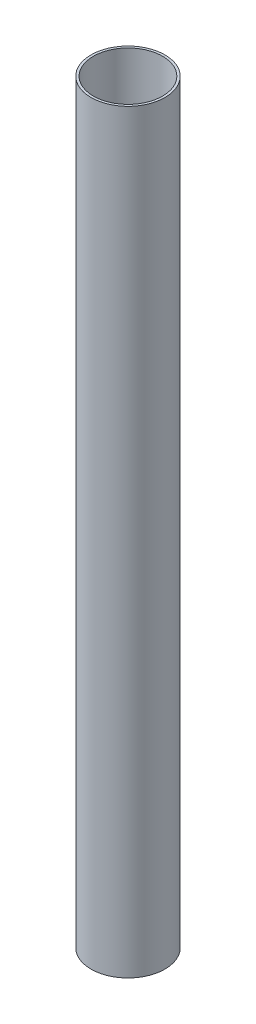
ISO-10303-21;
HEADER;
FILE_DESCRIPTION(('STEP AP214'),'2;1');
FILE_NAME('part.step','',(''),(''),'','','');
FILE_SCHEMA(('AUTOMOTIVE_DESIGN { 1 0 10303 214 1 1 1 1 }'));
ENDSEC;
DATA;
#1=APPLICATION_CONTEXT('core data for automotive mechanical design processes');
#2=APPLICATION_PROTOCOL_DEFINITION('international standard','automotive_design',2000,#1);
#3=PRODUCT_CONTEXT('',#1,'mechanical');
#4=PRODUCT('Part','Part','',(#3));
#5=PRODUCT_RELATED_PRODUCT_CATEGORY('part','',(#4));
#6=PRODUCT_DEFINITION_FORMATION('','',#4);
#7=PRODUCT_DEFINITION_CONTEXT('part definition',#1,'design');
#8=PRODUCT_DEFINITION('design','',#6,#7);
#9=PRODUCT_DEFINITION_SHAPE('','',#8);
#10=(LENGTH_UNIT() NAMED_UNIT(*) SI_UNIT(.MILLI.,.METRE.));
#11=(NAMED_UNIT(*) PLANE_ANGLE_UNIT() SI_UNIT($,.RADIAN.));
#12=(NAMED_UNIT(*) SI_UNIT($,.STERADIAN.) SOLID_ANGLE_UNIT());
#13=UNCERTAINTY_MEASURE_WITH_UNIT(LENGTH_MEASURE(1.E-05),#10,'distance_accuracy_value','');
#14=(GEOMETRIC_REPRESENTATION_CONTEXT(3) GLOBAL_UNCERTAINTY_ASSIGNED_CONTEXT((#13)) GLOBAL_UNIT_ASSIGNED_CONTEXT((#10,
#11,#12)) REPRESENTATION_CONTEXT('',''));
#15=CARTESIAN_POINT('',(0.,0.,0.));
#16=DIRECTION('',(0.,0.,1.));
#17=DIRECTION('',(1.,0.,0.));
#18=AXIS2_PLACEMENT_3D('',#15,#16,#17);
#19=CARTESIAN_POINT('',(0.,936.625,0.));
#20=DIRECTION('',(0.,1.,0.));
#21=DIRECTION('',(0.,0.,1.));
#22=AXIS2_PLACEMENT_3D('',#19,#20,#21);
#23=PLANE('',#22);
#24=CARTESIAN_POINT('',(0.,936.625,0.));
#25=DIRECTION('',(0.,1.,0.));
#26=DIRECTION('',(0.,0.,1.));
#27=AXIS2_PLACEMENT_3D('',#24,#25,#26);
#28=CIRCLE('',#27,45.847);
#29=CARTESIAN_POINT('',(0.,936.625,45.847));
#30=VERTEX_POINT('',#29);
#31=EDGE_CURVE('E10',#30,#30,#28,.T.);
#32=ORIENTED_EDGE('',*,*,#31,.T.);
#33=EDGE_LOOP('',(#32));
#34=FACE_BOUND('',#33,.T.);
#35=CARTESIAN_POINT('',(0.,936.625,0.));
#36=DIRECTION('',(0.,1.,0.));
#37=DIRECTION('',(0.,0.,1.));
#38=AXIS2_PLACEMENT_3D('',#35,#36,#37);
#39=CIRCLE('',#38,42.926);
#40=CARTESIAN_POINT('',(0.,936.625,42.926));
#41=VERTEX_POINT('',#40);
#42=EDGE_CURVE('E42',#41,#41,#39,.T.);
#43=ORIENTED_EDGE('',*,*,#42,.F.);
#44=EDGE_LOOP('',(#43));
#45=FACE_BOUND('',#44,.T.);
#46=ADVANCED_FACE('F31',(#34,#45),#23,.T.);
#47=CARTESIAN_POINT('',(0.,0.,0.));
#48=DIRECTION('',(0.,1.,0.));
#49=DIRECTION('',(0.,0.,1.));
#50=AXIS2_PLACEMENT_3D('',#47,#48,#49);
#51=PLANE('',#50);
#52=CARTESIAN_POINT('',(0.,0.,0.));
#53=DIRECTION('',(0.,1.,0.));
#54=DIRECTION('',(0.,0.,1.));
#55=AXIS2_PLACEMENT_3D('',#52,#53,#54);
#56=CIRCLE('',#55,45.847);
#57=CARTESIAN_POINT('',(0.,0.,45.847));
#58=VERTEX_POINT('',#57);
#59=EDGE_CURVE('E35',#58,#58,#56,.T.);
#60=ORIENTED_EDGE('',*,*,#59,.F.);
#61=EDGE_LOOP('',(#60));
#62=FACE_BOUND('',#61,.T.);
#63=CARTESIAN_POINT('',(0.,0.,0.));
#64=DIRECTION('',(0.,1.,0.));
#65=DIRECTION('',(0.,0.,1.));
#66=AXIS2_PLACEMENT_3D('',#63,#64,#65);
#67=CIRCLE('',#66,42.926);
#68=CARTESIAN_POINT('',(0.,0.,42.926));
#69=VERTEX_POINT('',#68);
#70=EDGE_CURVE('E44',#69,#69,#67,.T.);
#71=ORIENTED_EDGE('',*,*,#70,.T.);
#72=EDGE_LOOP('',(#71));
#73=FACE_BOUND('',#72,.T.);
#74=ADVANCED_FACE('F54',(#62,#73),#51,.F.);
#75=CARTESIAN_POINT('',(0.,936.625,0.));
#76=DIRECTION('',(0.,-1.,0.));
#77=DIRECTION('',(0.,0.,-1.));
#78=AXIS2_PLACEMENT_3D('',#75,#76,#77);
#79=CYLINDRICAL_SURFACE('',#78,45.847);
#80=ORIENTED_EDGE('',*,*,#31,.F.);
#81=EDGE_LOOP('',(#80));
#82=FACE_BOUND('',#81,.T.);
#83=ORIENTED_EDGE('',*,*,#59,.T.);
#84=EDGE_LOOP('',(#83));
#85=FACE_BOUND('',#84,.T.);
#86=ADVANCED_FACE('F33',(#82,#85),#79,.T.);
#87=CARTESIAN_POINT('',(0.,936.625,0.));
#88=DIRECTION('',(0.,-1.,0.));
#89=DIRECTION('',(0.,0.,-1.));
#90=AXIS2_PLACEMENT_3D('',#87,#88,#89);
#91=CYLINDRICAL_SURFACE('',#90,42.926);
#92=ORIENTED_EDGE('',*,*,#42,.T.);
#93=EDGE_LOOP('',(#92));
#94=FACE_BOUND('',#93,.T.);
#95=ORIENTED_EDGE('',*,*,#70,.F.);
#96=EDGE_LOOP('',(#95));
#97=FACE_BOUND('',#96,.T.);
#98=ADVANCED_FACE('F50',(#94,#97),#91,.F.);
#99=CLOSED_SHELL('',(#46,#74,#86,#98));
#100=MANIFOLD_SOLID_BREP('B2',#99);
#101=ADVANCED_BREP_SHAPE_REPRESENTATION('',(#18,#100),#14);
#102=SHAPE_DEFINITION_REPRESENTATION(#9,#101);
ENDSEC;
END-ISO-10303-21;
